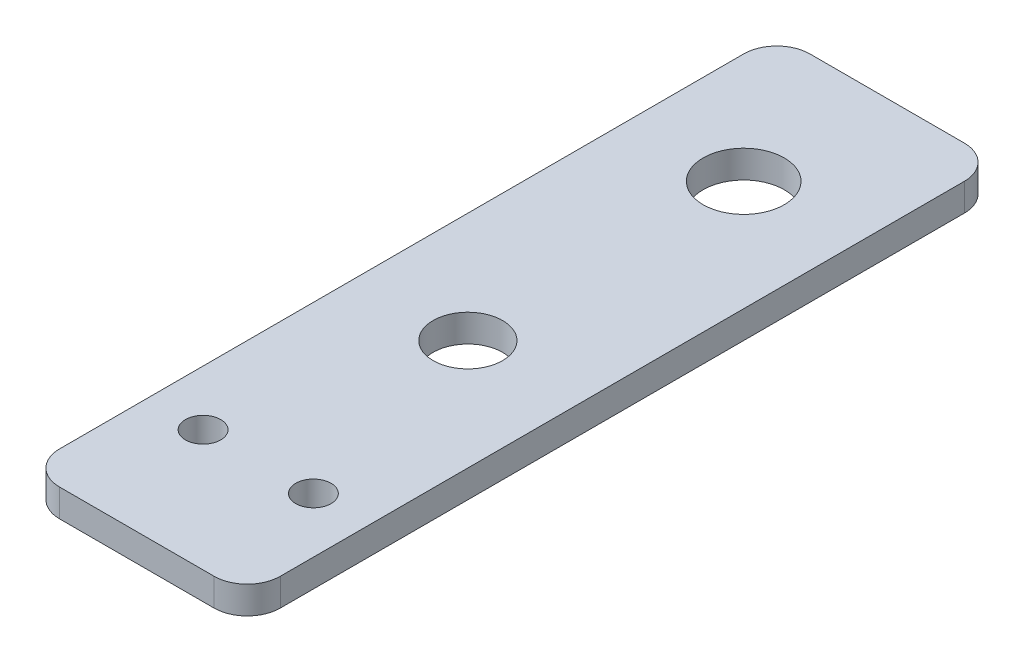
ISO-10303-21;
HEADER;
FILE_DESCRIPTION(('STEP AP214'),'2;1');
FILE_NAME('part.step','',(''),(''),'','','');
FILE_SCHEMA(('AUTOMOTIVE_DESIGN { 1 0 10303 214 1 1 1 1 }'));
ENDSEC;
DATA;
#1=APPLICATION_CONTEXT('core data for automotive mechanical design processes');
#2=APPLICATION_PROTOCOL_DEFINITION('international standard','automotive_design',2000,#1);
#3=PRODUCT_CONTEXT('',#1,'mechanical');
#4=PRODUCT('Part','Part','',(#3));
#5=PRODUCT_RELATED_PRODUCT_CATEGORY('part','',(#4));
#6=PRODUCT_DEFINITION_FORMATION('','',#4);
#7=PRODUCT_DEFINITION_CONTEXT('part definition',#1,'design');
#8=PRODUCT_DEFINITION('design','',#6,#7);
#9=PRODUCT_DEFINITION_SHAPE('','',#8);
#10=(LENGTH_UNIT() NAMED_UNIT(*) SI_UNIT(.MILLI.,.METRE.));
#11=(NAMED_UNIT(*) PLANE_ANGLE_UNIT() SI_UNIT($,.RADIAN.));
#12=(NAMED_UNIT(*) SI_UNIT($,.STERADIAN.) SOLID_ANGLE_UNIT());
#13=UNCERTAINTY_MEASURE_WITH_UNIT(LENGTH_MEASURE(1.E-05),#10,'distance_accuracy_value','');
#14=(GEOMETRIC_REPRESENTATION_CONTEXT(3) GLOBAL_UNCERTAINTY_ASSIGNED_CONTEXT((#13)) GLOBAL_UNIT_ASSIGNED_CONTEXT((#10,
#11,#12)) REPRESENTATION_CONTEXT('',''));
#15=CARTESIAN_POINT('',(0.,0.,0.));
#16=DIRECTION('',(0.,0.,1.));
#17=DIRECTION('',(1.,0.,0.));
#18=AXIS2_PLACEMENT_3D('',#15,#16,#17);
#19=CARTESIAN_POINT('',(0.,3.175,0.));
#20=DIRECTION('',(0.,1.,0.));
#21=DIRECTION('',(0.,0.,1.));
#22=AXIS2_PLACEMENT_3D('',#19,#20,#21);
#23=PLANE('',#22);
#24=CARTESIAN_POINT('',(-6.35,3.175,29.21));
#25=DIRECTION('',(0.,1.,0.));
#26=DIRECTION('',(0.,0.,1.));
#27=AXIS2_PLACEMENT_3D('',#24,#25,#26);
#28=CIRCLE('',#27,2.032);
#29=CARTESIAN_POINT('',(-6.35,3.175,31.242));
#30=VERTEX_POINT('',#29);
#31=EDGE_CURVE('E252',#30,#30,#28,.T.);
#32=ORIENTED_EDGE('',*,*,#31,.F.);
#33=EDGE_LOOP('',(#32));
#34=FACE_BOUND('',#33,.T.);
#35=CARTESIAN_POINT('',(0.,3.175,5.07999999999999));
#36=DIRECTION('',(0.,1.,0.));
#37=DIRECTION('',(0.,0.,1.));
#38=AXIS2_PLACEMENT_3D('',#35,#36,#37);
#39=CIRCLE('',#38,4.);
#40=CARTESIAN_POINT('',(0.,3.175,9.07999999999999));
#41=VERTEX_POINT('',#40);
#42=EDGE_CURVE('E192',#41,#41,#39,.T.);
#43=ORIENTED_EDGE('',*,*,#42,.F.);
#44=EDGE_LOOP('',(#43));
#45=FACE_BOUND('',#44,.T.);
#46=DIRECTION('',(0.,0.,-1.));
#47=VECTOR('',#46,1.);
#48=CARTESIAN_POINT('',(-12.7,3.175,43.18));
#49=LINE('',#48,#47);
#50=CARTESIAN_POINT('',(-12.7,3.175,39.37));
#51=VERTEX_POINT('',#50);
#52=CARTESIAN_POINT('',(-12.7,3.175,-39.37));
#53=VERTEX_POINT('',#52);
#54=EDGE_CURVE('E205',#51,#53,#49,.T.);
#55=ORIENTED_EDGE('',*,*,#54,.F.);
#56=CARTESIAN_POINT('',(-8.89,3.175,39.37));
#57=DIRECTION('',(0.,1.,0.));
#58=DIRECTION('',(0.,0.,1.));
#59=AXIS2_PLACEMENT_3D('',#56,#57,#58);
#60=CIRCLE('',#59,3.81);
#61=CARTESIAN_POINT('',(-8.89,3.175,43.18));
#62=VERTEX_POINT('',#61);
#63=EDGE_CURVE('E225',#51,#62,#60,.T.);
#64=ORIENTED_EDGE('',*,*,#63,.T.);
#65=DIRECTION('',(1.,0.,0.));
#66=VECTOR('',#65,1.);
#67=CARTESIAN_POINT('',(-12.7,3.175,43.18));
#68=LINE('',#67,#66);
#69=CARTESIAN_POINT('',(8.89,3.175,43.18));
#70=VERTEX_POINT('',#69);
#71=EDGE_CURVE('E183',#62,#70,#68,.T.);
#72=ORIENTED_EDGE('',*,*,#71,.T.);
#73=CARTESIAN_POINT('',(8.89,3.175,39.37));
#74=DIRECTION('',(0.,1.,0.));
#75=DIRECTION('',(0.,0.,1.));
#76=AXIS2_PLACEMENT_3D('',#73,#74,#75);
#77=CIRCLE('',#76,3.81);
#78=CARTESIAN_POINT('',(12.7,3.175,39.37));
#79=VERTEX_POINT('',#78);
#80=EDGE_CURVE('E219',#70,#79,#77,.T.);
#81=ORIENTED_EDGE('',*,*,#80,.T.);
#82=DIRECTION('',(0.,0.,-1.));
#83=VECTOR('',#82,1.);
#84=CARTESIAN_POINT('',(12.7,3.175,43.18));
#85=LINE('',#84,#83);
#86=CARTESIAN_POINT('',(12.7,3.175,-39.37));
#87=VERTEX_POINT('',#86);
#88=EDGE_CURVE('E232',#79,#87,#85,.T.);
#89=ORIENTED_EDGE('',*,*,#88,.T.);
#90=CARTESIAN_POINT('',(8.89,3.175,-39.37));
#91=DIRECTION('',(0.,1.,0.));
#92=DIRECTION('',(0.,0.,1.));
#93=AXIS2_PLACEMENT_3D('',#90,#91,#92);
#94=CIRCLE('',#93,3.81);
#95=CARTESIAN_POINT('',(8.89,3.175,-43.18));
#96=VERTEX_POINT('',#95);
#97=EDGE_CURVE('E111',#87,#96,#94,.T.);
#98=ORIENTED_EDGE('',*,*,#97,.T.);
#99=DIRECTION('',(1.,0.,0.));
#100=VECTOR('',#99,1.);
#101=CARTESIAN_POINT('',(-12.7,3.175,-43.18));
#102=LINE('',#101,#100);
#103=CARTESIAN_POINT('',(-8.89,3.175,-43.18));
#104=VERTEX_POINT('',#103);
#105=EDGE_CURVE('E238',#104,#96,#102,.T.);
#106=ORIENTED_EDGE('',*,*,#105,.F.);
#107=CARTESIAN_POINT('',(-8.89,3.175,-39.37));
#108=DIRECTION('',(0.,1.,0.));
#109=DIRECTION('',(0.,0.,1.));
#110=AXIS2_PLACEMENT_3D('',#107,#108,#109);
#111=CIRCLE('',#110,3.81);
#112=EDGE_CURVE('E220',#104,#53,#111,.T.);
#113=ORIENTED_EDGE('',*,*,#112,.T.);
#114=EDGE_LOOP('',(#55,#64,#72,#81,#89,#98,#106,#113));
#115=FACE_BOUND('',#114,.T.);
#116=CARTESIAN_POINT('',(0.,3.175,-26.67));
#117=DIRECTION('',(0.,1.,0.));
#118=DIRECTION('',(0.,0.,1.));
#119=AXIS2_PLACEMENT_3D('',#116,#117,#118);
#120=CIRCLE('',#119,4.66973318295596);
#121=CARTESIAN_POINT('',(0.,3.175,-22.000266817044));
#122=VERTEX_POINT('',#121);
#123=EDGE_CURVE('E250',#122,#122,#120,.T.);
#124=ORIENTED_EDGE('',*,*,#123,.F.);
#125=EDGE_LOOP('',(#124));
#126=FACE_BOUND('',#125,.T.);
#127=CARTESIAN_POINT('',(6.35,3.175,29.21));
#128=DIRECTION('',(0.,1.,0.));
#129=DIRECTION('',(0.,0.,1.));
#130=AXIS2_PLACEMENT_3D('',#127,#128,#129);
#131=CIRCLE('',#130,2.032);
#132=CARTESIAN_POINT('',(6.35,3.175,31.242));
#133=VERTEX_POINT('',#132);
#134=EDGE_CURVE('E256',#133,#133,#131,.T.);
#135=ORIENTED_EDGE('',*,*,#134,.F.);
#136=EDGE_LOOP('',(#135));
#137=FACE_BOUND('',#136,.T.);
#138=ADVANCED_FACE('F97',(#34,#45,#115,#126,#137),#23,.T.);
#139=CARTESIAN_POINT('',(0.,0.,0.));
#140=DIRECTION('',(0.,1.,0.));
#141=DIRECTION('',(0.,0.,1.));
#142=AXIS2_PLACEMENT_3D('',#139,#140,#141);
#143=PLANE('',#142);
#144=DIRECTION('',(1.,0.,0.));
#145=VECTOR('',#144,1.);
#146=CARTESIAN_POINT('',(-12.7,0.,43.18));
#147=LINE('',#146,#145);
#148=CARTESIAN_POINT('',(-8.89,0.,43.18));
#149=VERTEX_POINT('',#148);
#150=CARTESIAN_POINT('',(8.89,0.,43.18));
#151=VERTEX_POINT('',#150);
#152=EDGE_CURVE('E185',#149,#151,#147,.T.);
#153=ORIENTED_EDGE('',*,*,#152,.F.);
#154=CARTESIAN_POINT('',(-8.89,0.,39.37));
#155=DIRECTION('',(0.,1.,0.));
#156=DIRECTION('',(0.,0.,1.));
#157=AXIS2_PLACEMENT_3D('',#154,#155,#156);
#158=CIRCLE('',#157,3.81);
#159=CARTESIAN_POINT('',(-12.7,0.,39.37));
#160=VERTEX_POINT('',#159);
#161=EDGE_CURVE('E164',#149,#160,#158,.F.);
#162=ORIENTED_EDGE('',*,*,#161,.T.);
#163=DIRECTION('',(0.,0.,-1.));
#164=VECTOR('',#163,1.);
#165=CARTESIAN_POINT('',(-12.7,0.,43.18));
#166=LINE('',#165,#164);
#167=CARTESIAN_POINT('',(-12.7,0.,-39.37));
#168=VERTEX_POINT('',#167);
#169=EDGE_CURVE('E210',#160,#168,#166,.T.);
#170=ORIENTED_EDGE('',*,*,#169,.T.);
#171=CARTESIAN_POINT('',(-8.89,0.,-39.37));
#172=DIRECTION('',(0.,1.,0.));
#173=DIRECTION('',(0.,0.,1.));
#174=AXIS2_PLACEMENT_3D('',#171,#172,#173);
#175=CIRCLE('',#174,3.81);
#176=CARTESIAN_POINT('',(-8.89,0.,-43.18));
#177=VERTEX_POINT('',#176);
#178=EDGE_CURVE('E188',#168,#177,#175,.F.);
#179=ORIENTED_EDGE('',*,*,#178,.T.);
#180=DIRECTION('',(1.,0.,0.));
#181=VECTOR('',#180,1.);
#182=CARTESIAN_POINT('',(-12.7,0.,-43.18));
#183=LINE('',#182,#181);
#184=CARTESIAN_POINT('',(8.89,0.,-43.18));
#185=VERTEX_POINT('',#184);
#186=EDGE_CURVE('E198',#177,#185,#183,.T.);
#187=ORIENTED_EDGE('',*,*,#186,.T.);
#188=CARTESIAN_POINT('',(8.89,0.,-39.37));
#189=DIRECTION('',(0.,1.,0.));
#190=DIRECTION('',(0.,0.,1.));
#191=AXIS2_PLACEMENT_3D('',#188,#189,#190);
#192=CIRCLE('',#191,3.81);
#193=CARTESIAN_POINT('',(12.7,0.,-39.37));
#194=VERTEX_POINT('',#193);
#195=EDGE_CURVE('E211',#185,#194,#192,.F.);
#196=ORIENTED_EDGE('',*,*,#195,.T.);
#197=DIRECTION('',(0.,0.,-1.));
#198=VECTOR('',#197,1.);
#199=CARTESIAN_POINT('',(12.7,0.,43.18));
#200=LINE('',#199,#198);
#201=CARTESIAN_POINT('',(12.7,0.,39.37));
#202=VERTEX_POINT('',#201);
#203=EDGE_CURVE('E195',#202,#194,#200,.T.);
#204=ORIENTED_EDGE('',*,*,#203,.F.);
#205=CARTESIAN_POINT('',(8.89,0.,39.37));
#206=DIRECTION('',(0.,1.,0.));
#207=DIRECTION('',(0.,0.,1.));
#208=AXIS2_PLACEMENT_3D('',#205,#206,#207);
#209=CIRCLE('',#208,3.81);
#210=EDGE_CURVE('E176',#202,#151,#209,.F.);
#211=ORIENTED_EDGE('',*,*,#210,.T.);
#212=EDGE_LOOP('',(#153,#162,#170,#179,#187,#196,#204,#211));
#213=FACE_BOUND('',#212,.T.);
#214=CARTESIAN_POINT('',(0.,0.,5.07999999999999));
#215=DIRECTION('',(0.,1.,0.));
#216=DIRECTION('',(0.,0.,1.));
#217=AXIS2_PLACEMENT_3D('',#214,#215,#216);
#218=CIRCLE('',#217,4.);
#219=CARTESIAN_POINT('',(0.,0.,9.07999999999999));
#220=VERTEX_POINT('',#219);
#221=EDGE_CURVE('E200',#220,#220,#218,.T.);
#222=ORIENTED_EDGE('',*,*,#221,.T.);
#223=EDGE_LOOP('',(#222));
#224=FACE_BOUND('',#223,.T.);
#225=CARTESIAN_POINT('',(0.,0.,-26.67));
#226=DIRECTION('',(0.,1.,0.));
#227=DIRECTION('',(0.,0.,1.));
#228=AXIS2_PLACEMENT_3D('',#225,#226,#227);
#229=CIRCLE('',#228,4.66973318295596);
#230=CARTESIAN_POINT('',(0.,0.,-22.000266817044));
#231=VERTEX_POINT('',#230);
#232=EDGE_CURVE('E248',#231,#231,#229,.T.);
#233=ORIENTED_EDGE('',*,*,#232,.T.);
#234=EDGE_LOOP('',(#233));
#235=FACE_BOUND('',#234,.T.);
#236=CARTESIAN_POINT('',(-6.35,0.,29.21));
#237=DIRECTION('',(0.,1.,0.));
#238=DIRECTION('',(0.,0.,1.));
#239=AXIS2_PLACEMENT_3D('',#236,#237,#238);
#240=CIRCLE('',#239,2.032);
#241=CARTESIAN_POINT('',(-6.35,0.,31.242));
#242=VERTEX_POINT('',#241);
#243=EDGE_CURVE('E254',#242,#242,#240,.T.);
#244=ORIENTED_EDGE('',*,*,#243,.T.);
#245=EDGE_LOOP('',(#244));
#246=FACE_BOUND('',#245,.T.);
#247=CARTESIAN_POINT('',(6.35,0.,29.21));
#248=DIRECTION('',(0.,1.,0.));
#249=DIRECTION('',(0.,0.,1.));
#250=AXIS2_PLACEMENT_3D('',#247,#248,#249);
#251=CIRCLE('',#250,2.032);
#252=CARTESIAN_POINT('',(6.35,0.,31.242));
#253=VERTEX_POINT('',#252);
#254=EDGE_CURVE('E261',#253,#253,#251,.T.);
#255=ORIENTED_EDGE('',*,*,#254,.T.);
#256=EDGE_LOOP('',(#255));
#257=FACE_BOUND('',#256,.T.);
#258=ADVANCED_FACE('F189',(#213,#224,#235,#246,#257),#143,.F.);
#259=CARTESIAN_POINT('',(-12.7,3.175,43.18));
#260=DIRECTION('',(0.,0.,-1.));
#261=DIRECTION('',(-1.,0.,0.));
#262=AXIS2_PLACEMENT_3D('',#259,#260,#261);
#263=PLANE('',#262);
#264=ORIENTED_EDGE('',*,*,#71,.F.);
#265=DIRECTION('',(0.,-1.,0.));
#266=VECTOR('',#265,1.);
#267=CARTESIAN_POINT('',(-8.89,0.,43.18));
#268=LINE('',#267,#266);
#269=EDGE_CURVE('E166',#62,#149,#268,.T.);
#270=ORIENTED_EDGE('',*,*,#269,.T.);
#271=ORIENTED_EDGE('',*,*,#152,.T.);
#272=DIRECTION('',(0.,-1.,0.));
#273=VECTOR('',#272,1.);
#274=CARTESIAN_POINT('',(8.89,3.175,43.18));
#275=LINE('',#274,#273);
#276=EDGE_CURVE('E190',#151,#70,#275,.F.);
#277=ORIENTED_EDGE('',*,*,#276,.T.);
#278=EDGE_LOOP('',(#264,#270,#271,#277));
#279=FACE_BOUND('',#278,.T.);
#280=ADVANCED_FACE('F182',(#279),#263,.F.);
#281=CARTESIAN_POINT('',(12.7,3.175,43.18));
#282=DIRECTION('',(-1.,0.,0.));
#283=DIRECTION('',(0.,0.,1.));
#284=AXIS2_PLACEMENT_3D('',#281,#282,#283);
#285=PLANE('',#284);
#286=ORIENTED_EDGE('',*,*,#88,.F.);
#287=DIRECTION('',(0.,-1.,0.));
#288=VECTOR('',#287,1.);
#289=CARTESIAN_POINT('',(12.7,3.175,39.37));
#290=LINE('',#289,#288);
#291=EDGE_CURVE('E228',#79,#202,#290,.T.);
#292=ORIENTED_EDGE('',*,*,#291,.T.);
#293=ORIENTED_EDGE('',*,*,#203,.T.);
#294=DIRECTION('',(0.,-1.,0.));
#295=VECTOR('',#294,1.);
#296=CARTESIAN_POINT('',(12.7,3.175,-39.37));
#297=LINE('',#296,#295);
#298=EDGE_CURVE('E221',#194,#87,#297,.F.);
#299=ORIENTED_EDGE('',*,*,#298,.T.);
#300=EDGE_LOOP('',(#286,#292,#293,#299));
#301=FACE_BOUND('',#300,.T.);
#302=ADVANCED_FACE('F231',(#301),#285,.F.);
#303=CARTESIAN_POINT('',(-12.7,3.175,-43.18));
#304=DIRECTION('',(0.,0.,-1.));
#305=DIRECTION('',(-1.,0.,0.));
#306=AXIS2_PLACEMENT_3D('',#303,#304,#305);
#307=PLANE('',#306);
#308=ORIENTED_EDGE('',*,*,#105,.T.);
#309=DIRECTION('',(0.,-1.,0.));
#310=VECTOR('',#309,1.);
#311=CARTESIAN_POINT('',(8.89,0.,-43.18));
#312=LINE('',#311,#310);
#313=EDGE_CURVE('E12',#96,#185,#312,.T.);
#314=ORIENTED_EDGE('',*,*,#313,.T.);
#315=ORIENTED_EDGE('',*,*,#186,.F.);
#316=DIRECTION('',(0.,-1.,0.));
#317=VECTOR('',#316,1.);
#318=CARTESIAN_POINT('',(-8.89,3.175,-43.18));
#319=LINE('',#318,#317);
#320=EDGE_CURVE('E110',#177,#104,#319,.F.);
#321=ORIENTED_EDGE('',*,*,#320,.T.);
#322=EDGE_LOOP('',(#308,#314,#315,#321));
#323=FACE_BOUND('',#322,.T.);
#324=ADVANCED_FACE('F239',(#323),#307,.T.);
#325=CARTESIAN_POINT('',(-12.7,3.175,43.18));
#326=DIRECTION('',(-1.,0.,0.));
#327=DIRECTION('',(0.,0.,1.));
#328=AXIS2_PLACEMENT_3D('',#325,#326,#327);
#329=PLANE('',#328);
#330=ORIENTED_EDGE('',*,*,#169,.F.);
#331=DIRECTION('',(0.,-1.,0.));
#332=VECTOR('',#331,1.);
#333=CARTESIAN_POINT('',(-12.7,3.175,39.37));
#334=LINE('',#333,#332);
#335=EDGE_CURVE('E168',#160,#51,#334,.F.);
#336=ORIENTED_EDGE('',*,*,#335,.T.);
#337=ORIENTED_EDGE('',*,*,#54,.T.);
#338=DIRECTION('',(0.,-1.,0.));
#339=VECTOR('',#338,1.);
#340=CARTESIAN_POINT('',(-12.7,3.175,-39.37));
#341=LINE('',#340,#339);
#342=EDGE_CURVE('E172',#53,#168,#341,.T.);
#343=ORIENTED_EDGE('',*,*,#342,.T.);
#344=EDGE_LOOP('',(#330,#336,#337,#343));
#345=FACE_BOUND('',#344,.T.);
#346=ADVANCED_FACE('F284',(#345),#329,.T.);
#347=CARTESIAN_POINT('',(0.,3.175,5.07999999999999));
#348=DIRECTION('',(0.,-1.,0.));
#349=DIRECTION('',(0.,0.,-1.));
#350=AXIS2_PLACEMENT_3D('',#347,#348,#349);
#351=CYLINDRICAL_SURFACE('',#350,4.);
#352=ORIENTED_EDGE('',*,*,#42,.T.);
#353=EDGE_LOOP('',(#352));
#354=FACE_BOUND('',#353,.T.);
#355=ORIENTED_EDGE('',*,*,#221,.F.);
#356=EDGE_LOOP('',(#355));
#357=FACE_BOUND('',#356,.T.);
#358=ADVANCED_FACE('F283',(#354,#357),#351,.F.);
#359=CARTESIAN_POINT('',(0.,3.175,-26.67));
#360=DIRECTION('',(0.,-1.,0.));
#361=DIRECTION('',(0.,0.,-1.));
#362=AXIS2_PLACEMENT_3D('',#359,#360,#361);
#363=CYLINDRICAL_SURFACE('',#362,4.66973318295596);
#364=ORIENTED_EDGE('',*,*,#123,.T.);
#365=EDGE_LOOP('',(#364));
#366=FACE_BOUND('',#365,.T.);
#367=ORIENTED_EDGE('',*,*,#232,.F.);
#368=EDGE_LOOP('',(#367));
#369=FACE_BOUND('',#368,.T.);
#370=ADVANCED_FACE('F309',(#366,#369),#363,.F.);
#371=CARTESIAN_POINT('',(-6.35,3.175,29.21));
#372=DIRECTION('',(0.,-1.,0.));
#373=DIRECTION('',(0.,0.,-1.));
#374=AXIS2_PLACEMENT_3D('',#371,#372,#373);
#375=CYLINDRICAL_SURFACE('',#374,2.032);
#376=ORIENTED_EDGE('',*,*,#31,.T.);
#377=EDGE_LOOP('',(#376));
#378=FACE_BOUND('',#377,.T.);
#379=ORIENTED_EDGE('',*,*,#243,.F.);
#380=EDGE_LOOP('',(#379));
#381=FACE_BOUND('',#380,.T.);
#382=ADVANCED_FACE('F311',(#378,#381),#375,.F.);
#383=CARTESIAN_POINT('',(6.35,3.175,29.21));
#384=DIRECTION('',(0.,-1.,0.));
#385=DIRECTION('',(0.,0.,-1.));
#386=AXIS2_PLACEMENT_3D('',#383,#384,#385);
#387=CYLINDRICAL_SURFACE('',#386,2.032);
#388=ORIENTED_EDGE('',*,*,#134,.T.);
#389=EDGE_LOOP('',(#388));
#390=FACE_BOUND('',#389,.T.);
#391=ORIENTED_EDGE('',*,*,#254,.F.);
#392=EDGE_LOOP('',(#391));
#393=FACE_BOUND('',#392,.T.);
#394=ADVANCED_FACE('F270',(#390,#393),#387,.F.);
#395=CARTESIAN_POINT('',(-8.89,3.175,39.37));
#396=DIRECTION('',(0.,1.,0.));
#397=DIRECTION('',(0.,0.,1.));
#398=AXIS2_PLACEMENT_3D('',#395,#396,#397);
#399=CYLINDRICAL_SURFACE('',#398,3.81);
#400=ORIENTED_EDGE('',*,*,#63,.F.);
#401=ORIENTED_EDGE('',*,*,#335,.F.);
#402=ORIENTED_EDGE('',*,*,#161,.F.);
#403=ORIENTED_EDGE('',*,*,#269,.F.);
#404=EDGE_LOOP('',(#400,#401,#402,#403));
#405=FACE_BOUND('',#404,.T.);
#406=ADVANCED_FACE('F169',(#405),#399,.T.);
#407=CARTESIAN_POINT('',(8.89,3.175,39.37));
#408=DIRECTION('',(0.,-1.,0.));
#409=DIRECTION('',(0.,0.,-1.));
#410=AXIS2_PLACEMENT_3D('',#407,#408,#409);
#411=CYLINDRICAL_SURFACE('',#410,3.81);
#412=ORIENTED_EDGE('',*,*,#80,.F.);
#413=ORIENTED_EDGE('',*,*,#276,.F.);
#414=ORIENTED_EDGE('',*,*,#210,.F.);
#415=ORIENTED_EDGE('',*,*,#291,.F.);
#416=EDGE_LOOP('',(#412,#413,#414,#415));
#417=FACE_BOUND('',#416,.T.);
#418=ADVANCED_FACE('F298',(#417),#411,.T.);
#419=CARTESIAN_POINT('',(8.89,3.175,-39.37));
#420=DIRECTION('',(0.,1.,0.));
#421=DIRECTION('',(0.,0.,1.));
#422=AXIS2_PLACEMENT_3D('',#419,#420,#421);
#423=CYLINDRICAL_SURFACE('',#422,3.81);
#424=ORIENTED_EDGE('',*,*,#97,.F.);
#425=ORIENTED_EDGE('',*,*,#298,.F.);
#426=ORIENTED_EDGE('',*,*,#195,.F.);
#427=ORIENTED_EDGE('',*,*,#313,.F.);
#428=EDGE_LOOP('',(#424,#425,#426,#427));
#429=FACE_BOUND('',#428,.T.);
#430=ADVANCED_FACE('F236',(#429),#423,.T.);
#431=CARTESIAN_POINT('',(-8.89,3.175,-39.37));
#432=DIRECTION('',(0.,-1.,0.));
#433=DIRECTION('',(0.,0.,-1.));
#434=AXIS2_PLACEMENT_3D('',#431,#432,#433);
#435=CYLINDRICAL_SURFACE('',#434,3.81);
#436=ORIENTED_EDGE('',*,*,#112,.F.);
#437=ORIENTED_EDGE('',*,*,#320,.F.);
#438=ORIENTED_EDGE('',*,*,#178,.F.);
#439=ORIENTED_EDGE('',*,*,#342,.F.);
#440=EDGE_LOOP('',(#436,#437,#438,#439));
#441=FACE_BOUND('',#440,.T.);
#442=ADVANCED_FACE('F101',(#441),#435,.T.);
#443=CLOSED_SHELL('',(#138,#258,#280,#302,#324,#346,#358,#370,#382,#394,#406,#418,#430,#442));
#444=MANIFOLD_SOLID_BREP('B2',#443);
#445=ADVANCED_BREP_SHAPE_REPRESENTATION('',(#18,#444),#14);
#446=SHAPE_DEFINITION_REPRESENTATION(#9,#445);
ENDSEC;
END-ISO-10303-21;
